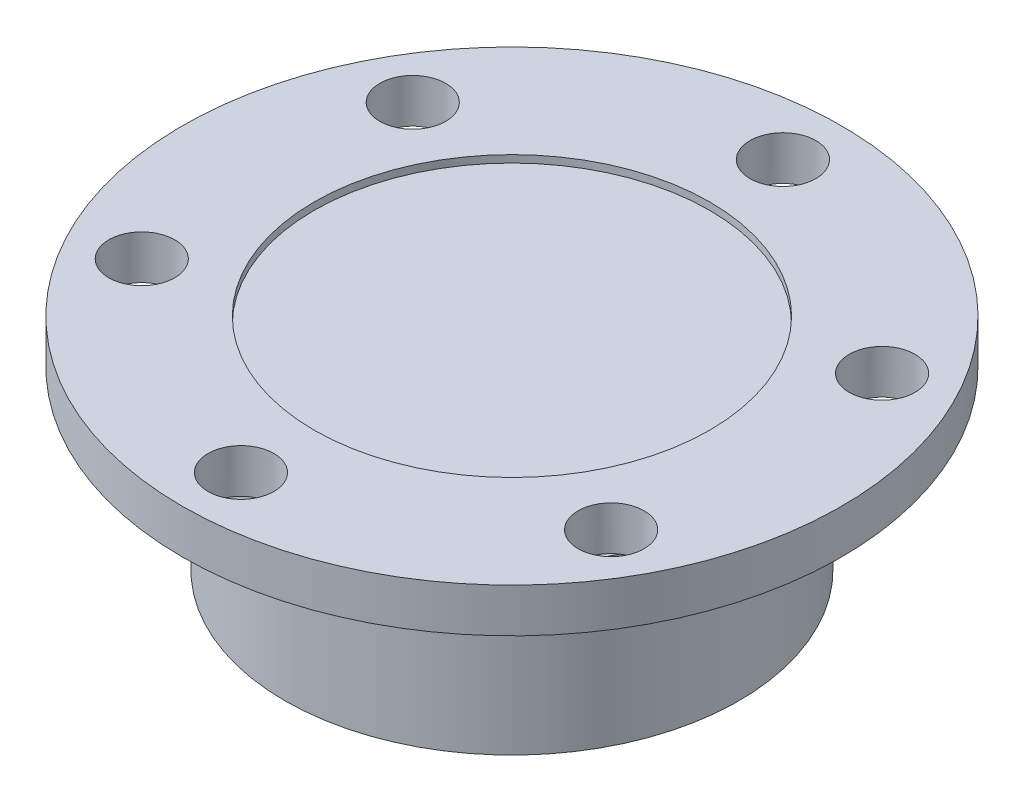
ISO-10303-21;
HEADER;
FILE_DESCRIPTION(('STEP AP214'),'2;1');
FILE_NAME('part.step','',(''),(''),'','','');
FILE_SCHEMA(('AUTOMOTIVE_DESIGN { 1 0 10303 214 1 1 1 1 }'));
ENDSEC;
DATA;
#1=APPLICATION_CONTEXT('core data for automotive mechanical design processes');
#2=APPLICATION_PROTOCOL_DEFINITION('international standard','automotive_design',2000,#1);
#3=PRODUCT_CONTEXT('',#1,'mechanical');
#4=PRODUCT('Part','Part','',(#3));
#5=PRODUCT_RELATED_PRODUCT_CATEGORY('part','',(#4));
#6=PRODUCT_DEFINITION_FORMATION('','',#4);
#7=PRODUCT_DEFINITION_CONTEXT('part definition',#1,'design');
#8=PRODUCT_DEFINITION('design','',#6,#7);
#9=PRODUCT_DEFINITION_SHAPE('','',#8);
#10=(LENGTH_UNIT() NAMED_UNIT(*) SI_UNIT(.MILLI.,.METRE.));
#11=(NAMED_UNIT(*) PLANE_ANGLE_UNIT() SI_UNIT($,.RADIAN.));
#12=(NAMED_UNIT(*) SI_UNIT($,.STERADIAN.) SOLID_ANGLE_UNIT());
#13=UNCERTAINTY_MEASURE_WITH_UNIT(LENGTH_MEASURE(1.E-05),#10,'distance_accuracy_value','');
#14=(GEOMETRIC_REPRESENTATION_CONTEXT(3) GLOBAL_UNCERTAINTY_ASSIGNED_CONTEXT((#13)) GLOBAL_UNIT_ASSIGNED_CONTEXT((#10,
#11,#12)) REPRESENTATION_CONTEXT('',''));
#15=CARTESIAN_POINT('',(0.,0.,0.));
#16=DIRECTION('',(0.,0.,1.));
#17=DIRECTION('',(1.,0.,0.));
#18=AXIS2_PLACEMENT_3D('',#15,#16,#17);
#19=CARTESIAN_POINT('',(-27.,29.,0.));
#20=DIRECTION('',(0.,1.,0.));
#21=DIRECTION('',(0.,0.,1.));
#22=AXIS2_PLACEMENT_3D('',#19,#20,#21);
#23=PLANE('',#22);
#24=CARTESIAN_POINT('',(0.,29.,0.));
#25=DIRECTION('',(0.,1.,0.));
#26=DIRECTION('',(0.,0.,1.));
#27=AXIS2_PLACEMENT_3D('',#24,#25,#26);
#28=CIRCLE('',#27,27.);
#29=CARTESIAN_POINT('',(0.,29.,27.));
#30=VERTEX_POINT('',#29);
#31=EDGE_CURVE('E64',#30,#30,#28,.T.);
#32=ORIENTED_EDGE('',*,*,#31,.T.);
#33=EDGE_LOOP('',(#32));
#34=FACE_BOUND('',#33,.T.);
#35=ADVANCED_FACE('F30',(#34),#23,.T.);
#36=CARTESIAN_POINT('',(-22.,26.5,0.));
#37=DIRECTION('',(0.,-1.,0.));
#38=DIRECTION('',(0.,0.,-1.));
#39=AXIS2_PLACEMENT_3D('',#36,#37,#38);
#40=PLANE('',#39);
#41=CARTESIAN_POINT('',(0.,26.5,0.));
#42=DIRECTION('',(0.,1.,0.));
#43=DIRECTION('',(0.,0.,1.));
#44=AXIS2_PLACEMENT_3D('',#41,#42,#43);
#45=CIRCLE('',#44,22.);
#46=CARTESIAN_POINT('',(0.,26.5,22.));
#47=VERTEX_POINT('',#46);
#48=EDGE_CURVE('E10',#47,#47,#45,.T.);
#49=ORIENTED_EDGE('',*,*,#48,.F.);
#50=EDGE_LOOP('',(#49));
#51=FACE_BOUND('',#50,.T.);
#52=ADVANCED_FACE('F133',(#51),#40,.T.);
#53=CARTESIAN_POINT('',(0.,0.,0.));
#54=DIRECTION('',(0.,-1.,0.));
#55=DIRECTION('',(0.,0.,-1.));
#56=AXIS2_PLACEMENT_3D('',#53,#54,#55);
#57=CONICAL_SURFACE('',#56,26.6726649887742,0.174532925199429);
#58=ORIENTED_EDGE('',*,*,#48,.T.);
#59=EDGE_LOOP('',(#58));
#60=FACE_BOUND('',#59,.T.);
#61=CARTESIAN_POINT('',(0.,0.,0.));
#62=DIRECTION('',(0.,1.,0.));
#63=DIRECTION('',(0.,0.,1.));
#64=AXIS2_PLACEMENT_3D('',#61,#62,#63);
#65=CIRCLE('',#64,26.6726649887742);
#66=CARTESIAN_POINT('',(0.,0.,26.6726649887742));
#67=VERTEX_POINT('',#66);
#68=EDGE_CURVE('E36',#67,#67,#65,.T.);
#69=ORIENTED_EDGE('',*,*,#68,.F.);
#70=EDGE_LOOP('',(#69));
#71=FACE_BOUND('',#70,.T.);
#72=ADVANCED_FACE('F137',(#60,#71),#57,.F.);
#73=CARTESIAN_POINT('',(-31.,0.,0.));
#74=DIRECTION('',(0.,-1.,0.));
#75=DIRECTION('',(0.,0.,-1.));
#76=AXIS2_PLACEMENT_3D('',#73,#74,#75);
#77=PLANE('',#76);
#78=ORIENTED_EDGE('',*,*,#68,.T.);
#79=EDGE_LOOP('',(#78));
#80=FACE_BOUND('',#79,.T.);
#81=CARTESIAN_POINT('',(0.,0.,0.));
#82=DIRECTION('',(0.,1.,0.));
#83=DIRECTION('',(0.,0.,1.));
#84=AXIS2_PLACEMENT_3D('',#81,#82,#83);
#85=CIRCLE('',#84,31.);
#86=CARTESIAN_POINT('',(0.,0.,31.));
#87=VERTEX_POINT('',#86);
#88=EDGE_CURVE('E40',#87,#87,#85,.T.);
#89=ORIENTED_EDGE('',*,*,#88,.F.);
#90=EDGE_LOOP('',(#89));
#91=FACE_BOUND('',#90,.T.);
#92=ADVANCED_FACE('F142',(#80,#91),#77,.T.);
#93=CARTESIAN_POINT('',(0.,30.6187975640425,0.));
#94=DIRECTION('',(0.,1.,0.));
#95=DIRECTION('',(0.,0.,1.));
#96=AXIS2_PLACEMENT_3D('',#93,#94,#95);
#97=CYLINDRICAL_SURFACE('',#96,31.);
#98=ORIENTED_EDGE('',*,*,#88,.T.);
#99=EDGE_LOOP('',(#98));
#100=FACE_BOUND('',#99,.T.);
#101=CARTESIAN_POINT('',(0.,22.5,0.));
#102=DIRECTION('',(0.,1.,0.));
#103=DIRECTION('',(0.,0.,1.));
#104=AXIS2_PLACEMENT_3D('',#101,#102,#103);
#105=CIRCLE('',#104,31.);
#106=CARTESIAN_POINT('',(0.,22.5,31.));
#107=VERTEX_POINT('',#106);
#108=EDGE_CURVE('E44',#107,#107,#105,.T.);
#109=ORIENTED_EDGE('',*,*,#108,.F.);
#110=EDGE_LOOP('',(#109));
#111=FACE_BOUND('',#110,.T.);
#112=ADVANCED_FACE('F147',(#100,#111),#97,.T.);
#113=CARTESIAN_POINT('',(-29.5,22.5,0.));
#114=DIRECTION('',(0.,1.,0.));
#115=DIRECTION('',(0.,0.,1.));
#116=AXIS2_PLACEMENT_3D('',#113,#114,#115);
#117=PLANE('',#116);
#118=ORIENTED_EDGE('',*,*,#108,.T.);
#119=EDGE_LOOP('',(#118));
#120=FACE_BOUND('',#119,.T.);
#121=CARTESIAN_POINT('',(0.,22.5,0.));
#122=DIRECTION('',(0.,1.,0.));
#123=DIRECTION('',(0.,0.,1.));
#124=AXIS2_PLACEMENT_3D('',#121,#122,#123);
#125=CIRCLE('',#124,29.5);
#126=CARTESIAN_POINT('',(0.,22.5,29.5));
#127=VERTEX_POINT('',#126);
#128=EDGE_CURVE('E49',#127,#127,#125,.T.);
#129=ORIENTED_EDGE('',*,*,#128,.F.);
#130=EDGE_LOOP('',(#129));
#131=FACE_BOUND('',#130,.T.);
#132=ADVANCED_FACE('F150',(#120,#131),#117,.T.);
#133=CARTESIAN_POINT('',(0.,30.6187975640425,0.));
#134=DIRECTION('',(0.,1.,0.));
#135=DIRECTION('',(0.,0.,1.));
#136=AXIS2_PLACEMENT_3D('',#133,#134,#135);
#137=CYLINDRICAL_SURFACE('',#136,29.5);
#138=ORIENTED_EDGE('',*,*,#128,.T.);
#139=EDGE_LOOP('',(#138));
#140=FACE_BOUND('',#139,.T.);
#141=CARTESIAN_POINT('',(0.,24.,0.));
#142=DIRECTION('',(0.,1.,0.));
#143=DIRECTION('',(0.,0.,1.));
#144=AXIS2_PLACEMENT_3D('',#141,#142,#143);
#145=CIRCLE('',#144,29.5);
#146=CARTESIAN_POINT('',(0.,24.,29.5));
#147=VERTEX_POINT('',#146);
#148=EDGE_CURVE('E52',#147,#147,#145,.T.);
#149=ORIENTED_EDGE('',*,*,#148,.F.);
#150=EDGE_LOOP('',(#149));
#151=FACE_BOUND('',#150,.T.);
#152=ADVANCED_FACE('F154',(#140,#151),#137,.T.);
#153=CARTESIAN_POINT('',(-45.,24.,0.));
#154=DIRECTION('',(0.,-1.,0.));
#155=DIRECTION('',(0.,0.,-1.));
#156=AXIS2_PLACEMENT_3D('',#153,#154,#155);
#157=PLANE('',#156);
#158=CARTESIAN_POINT('',(0.,24.,-37.));
#159=DIRECTION('',(0.,-1.,0.));
#160=DIRECTION('',(0.,0.,-1.));
#161=AXIS2_PLACEMENT_3D('',#158,#159,#160);
#162=CIRCLE('',#161,4.5);
#163=CARTESIAN_POINT('',(0.,24.,-41.5));
#164=VERTEX_POINT('',#163);
#165=EDGE_CURVE('E93',#164,#164,#162,.F.);
#166=ORIENTED_EDGE('',*,*,#165,.T.);
#167=EDGE_LOOP('',(#166));
#168=FACE_BOUND('',#167,.T.);
#169=CARTESIAN_POINT('',(-32.0429399400232,24.,-18.4999999999982));
#170=DIRECTION('',(0.,-1.,0.));
#171=DIRECTION('',(0.,0.,-1.));
#172=AXIS2_PLACEMENT_3D('',#169,#170,#171);
#173=CIRCLE('',#172,4.50000000000197);
#174=CARTESIAN_POINT('',(-32.0429399400232,24.,-23.0000000000001));
#175=VERTEX_POINT('',#174);
#176=EDGE_CURVE('E94',#175,#175,#173,.F.);
#177=ORIENTED_EDGE('',*,*,#176,.T.);
#178=EDGE_LOOP('',(#177));
#179=FACE_BOUND('',#178,.T.);
#180=CARTESIAN_POINT('',(-32.0429399400211,24.,18.5000000000018));
#181=DIRECTION('',(0.,-1.,0.));
#182=DIRECTION('',(0.,0.,-1.));
#183=AXIS2_PLACEMENT_3D('',#180,#181,#182);
#184=CIRCLE('',#183,4.5000000000039);
#185=CARTESIAN_POINT('',(-32.0429399400211,24.,13.9999999999979));
#186=VERTEX_POINT('',#185);
#187=EDGE_CURVE('E68',#186,#186,#184,.F.);
#188=ORIENTED_EDGE('',*,*,#187,.T.);
#189=EDGE_LOOP('',(#188));
#190=FACE_BOUND('',#189,.T.);
#191=CARTESIAN_POINT('',(4.1990728836402E-12,24.,37.));
#192=DIRECTION('',(0.,-1.,0.));
#193=DIRECTION('',(0.,0.,-1.));
#194=AXIS2_PLACEMENT_3D('',#191,#192,#193);
#195=CIRCLE('',#194,4.50000000000426);
#196=CARTESIAN_POINT('',(4.1990728836402E-12,24.,32.4999999999957));
#197=VERTEX_POINT('',#196);
#198=EDGE_CURVE('E75',#197,#197,#195,.F.);
#199=ORIENTED_EDGE('',*,*,#198,.T.);
#200=EDGE_LOOP('',(#199));
#201=FACE_BOUND('',#200,.T.);
#202=CARTESIAN_POINT('',(32.0429399400274,24.,18.4999999999982));
#203=DIRECTION('',(0.,-1.,0.));
#204=DIRECTION('',(0.,0.,-1.));
#205=AXIS2_PLACEMENT_3D('',#202,#203,#204);
#206=CIRCLE('',#205,4.50000000000265);
#207=CARTESIAN_POINT('',(32.0429399400274,24.,13.9999999999955));
#208=VERTEX_POINT('',#207);
#209=EDGE_CURVE('E81',#208,#208,#206,.F.);
#210=ORIENTED_EDGE('',*,*,#209,.T.);
#211=EDGE_LOOP('',(#210));
#212=FACE_BOUND('',#211,.T.);
#213=CARTESIAN_POINT('',(32.0429399400253,24.,-18.5000000000018));
#214=DIRECTION('',(0.,-1.,0.));
#215=DIRECTION('',(0.,0.,-1.));
#216=AXIS2_PLACEMENT_3D('',#213,#214,#215);
#217=CIRCLE('',#216,4.50000000000057);
#218=CARTESIAN_POINT('',(32.0429399400253,24.,-23.0000000000024));
#219=VERTEX_POINT('',#218);
#220=EDGE_CURVE('E87',#219,#219,#217,.F.);
#221=ORIENTED_EDGE('',*,*,#220,.T.);
#222=EDGE_LOOP('',(#221));
#223=FACE_BOUND('',#222,.T.);
#224=ORIENTED_EDGE('',*,*,#148,.T.);
#225=EDGE_LOOP('',(#224));
#226=FACE_BOUND('',#225,.T.);
#227=CARTESIAN_POINT('',(0.,24.,0.));
#228=DIRECTION('',(0.,1.,0.));
#229=DIRECTION('',(0.,0.,1.));
#230=AXIS2_PLACEMENT_3D('',#227,#228,#229);
#231=CIRCLE('',#230,45.);
#232=CARTESIAN_POINT('',(0.,24.,45.));
#233=VERTEX_POINT('',#232);
#234=EDGE_CURVE('E55',#233,#233,#231,.T.);
#235=ORIENTED_EDGE('',*,*,#234,.F.);
#236=EDGE_LOOP('',(#235));
#237=FACE_BOUND('',#236,.T.);
#238=ADVANCED_FACE('F158',(#168,#179,#190,#201,#212,#223,#226,#237),#157,.T.);
#239=CARTESIAN_POINT('',(0.,30.6187975640425,0.));
#240=DIRECTION('',(0.,1.,0.));
#241=DIRECTION('',(0.,0.,1.));
#242=AXIS2_PLACEMENT_3D('',#239,#240,#241);
#243=CYLINDRICAL_SURFACE('',#242,45.);
#244=ORIENTED_EDGE('',*,*,#234,.T.);
#245=EDGE_LOOP('',(#244));
#246=FACE_BOUND('',#245,.T.);
#247=CARTESIAN_POINT('',(0.,30.,0.));
#248=DIRECTION('',(0.,1.,0.));
#249=DIRECTION('',(0.,0.,1.));
#250=AXIS2_PLACEMENT_3D('',#247,#248,#249);
#251=CIRCLE('',#250,45.);
#252=CARTESIAN_POINT('',(0.,30.,45.));
#253=VERTEX_POINT('',#252);
#254=EDGE_CURVE('E58',#253,#253,#251,.T.);
#255=ORIENTED_EDGE('',*,*,#254,.F.);
#256=EDGE_LOOP('',(#255));
#257=FACE_BOUND('',#256,.T.);
#258=ADVANCED_FACE('F110',(#246,#257),#243,.T.);
#259=CARTESIAN_POINT('',(-45.,30.,0.));
#260=DIRECTION('',(0.,1.,0.));
#261=DIRECTION('',(0.,0.,1.));
#262=AXIS2_PLACEMENT_3D('',#259,#260,#261);
#263=PLANE('',#262);
#264=CARTESIAN_POINT('',(0.,30.,-37.));
#265=DIRECTION('',(0.,1.,0.));
#266=DIRECTION('',(0.,0.,1.));
#267=AXIS2_PLACEMENT_3D('',#264,#265,#266);
#268=CIRCLE('',#267,4.5);
#269=CARTESIAN_POINT('',(0.,30.,-32.5));
#270=VERTEX_POINT('',#269);
#271=EDGE_CURVE('E67',#270,#270,#268,.T.);
#272=ORIENTED_EDGE('',*,*,#271,.F.);
#273=EDGE_LOOP('',(#272));
#274=FACE_BOUND('',#273,.T.);
#275=CARTESIAN_POINT('',(-32.0429399400232,30.,-18.4999999999982));
#276=DIRECTION('',(0.,1.,0.));
#277=DIRECTION('',(0.,0.,1.));
#278=AXIS2_PLACEMENT_3D('',#275,#276,#277);
#279=CIRCLE('',#278,4.50000000000197);
#280=CARTESIAN_POINT('',(-32.0429399400232,30.,-13.9999999999962));
#281=VERTEX_POINT('',#280);
#282=EDGE_CURVE('E72',#281,#281,#279,.T.);
#283=ORIENTED_EDGE('',*,*,#282,.F.);
#284=EDGE_LOOP('',(#283));
#285=FACE_BOUND('',#284,.T.);
#286=CARTESIAN_POINT('',(-32.0429399400211,30.,18.5000000000018));
#287=DIRECTION('',(0.,1.,0.));
#288=DIRECTION('',(0.,0.,1.));
#289=AXIS2_PLACEMENT_3D('',#286,#287,#288);
#290=CIRCLE('',#289,4.5000000000039);
#291=CARTESIAN_POINT('',(-32.0429399400211,30.,23.0000000000057));
#292=VERTEX_POINT('',#291);
#293=EDGE_CURVE('E71',#292,#292,#290,.T.);
#294=ORIENTED_EDGE('',*,*,#293,.F.);
#295=EDGE_LOOP('',(#294));
#296=FACE_BOUND('',#295,.T.);
#297=CARTESIAN_POINT('',(4.1990728836402E-12,30.,37.));
#298=DIRECTION('',(0.,1.,0.));
#299=DIRECTION('',(0.,0.,1.));
#300=AXIS2_PLACEMENT_3D('',#297,#298,#299);
#301=CIRCLE('',#300,4.50000000000426);
#302=CARTESIAN_POINT('',(4.1990728836402E-12,30.,41.5000000000043));
#303=VERTEX_POINT('',#302);
#304=EDGE_CURVE('E78',#303,#303,#301,.T.);
#305=ORIENTED_EDGE('',*,*,#304,.F.);
#306=EDGE_LOOP('',(#305));
#307=FACE_BOUND('',#306,.T.);
#308=CARTESIAN_POINT('',(32.0429399400274,30.,18.4999999999982));
#309=DIRECTION('',(0.,1.,0.));
#310=DIRECTION('',(0.,0.,1.));
#311=AXIS2_PLACEMENT_3D('',#308,#309,#310);
#312=CIRCLE('',#311,4.50000000000265);
#313=CARTESIAN_POINT('',(32.0429399400274,30.,23.0000000000008));
#314=VERTEX_POINT('',#313);
#315=EDGE_CURVE('E84',#314,#314,#312,.T.);
#316=ORIENTED_EDGE('',*,*,#315,.F.);
#317=EDGE_LOOP('',(#316));
#318=FACE_BOUND('',#317,.T.);
#319=CARTESIAN_POINT('',(32.0429399400253,30.,-18.5000000000018));
#320=DIRECTION('',(0.,1.,0.));
#321=DIRECTION('',(0.,0.,1.));
#322=AXIS2_PLACEMENT_3D('',#319,#320,#321);
#323=CIRCLE('',#322,4.50000000000057);
#324=CARTESIAN_POINT('',(32.0429399400253,30.,-14.0000000000013));
#325=VERTEX_POINT('',#324);
#326=EDGE_CURVE('E90',#325,#325,#323,.T.);
#327=ORIENTED_EDGE('',*,*,#326,.F.);
#328=EDGE_LOOP('',(#327));
#329=FACE_BOUND('',#328,.T.);
#330=ORIENTED_EDGE('',*,*,#254,.T.);
#331=EDGE_LOOP('',(#330));
#332=FACE_BOUND('',#331,.T.);
#333=CARTESIAN_POINT('',(0.,30.,0.));
#334=DIRECTION('',(0.,1.,0.));
#335=DIRECTION('',(0.,0.,1.));
#336=AXIS2_PLACEMENT_3D('',#333,#334,#335);
#337=CIRCLE('',#336,27.);
#338=CARTESIAN_POINT('',(0.,30.,27.));
#339=VERTEX_POINT('',#338);
#340=EDGE_CURVE('E61',#339,#339,#337,.T.);
#341=ORIENTED_EDGE('',*,*,#340,.F.);
#342=EDGE_LOOP('',(#341));
#343=FACE_BOUND('',#342,.T.);
#344=ADVANCED_FACE('F106',(#274,#285,#296,#307,#318,#329,#332,#343),#263,.T.);
#345=CARTESIAN_POINT('',(0.,30.6187975640425,0.));
#346=DIRECTION('',(0.,1.,0.));
#347=DIRECTION('',(0.,0.,1.));
#348=AXIS2_PLACEMENT_3D('',#345,#346,#347);
#349=CYLINDRICAL_SURFACE('',#348,27.);
#350=ORIENTED_EDGE('',*,*,#340,.T.);
#351=EDGE_LOOP('',(#350));
#352=FACE_BOUND('',#351,.T.);
#353=ORIENTED_EDGE('',*,*,#31,.F.);
#354=EDGE_LOOP('',(#353));
#355=FACE_BOUND('',#354,.T.);
#356=ADVANCED_FACE('F109',(#352,#355),#349,.F.);
#357=CARTESIAN_POINT('',(32.0429399400253,-0.001000000000001,-18.5000000000018));
#358=DIRECTION('',(0.,1.,0.));
#359=DIRECTION('',(0.,0.,1.));
#360=AXIS2_PLACEMENT_3D('',#357,#358,#359);
#361=CYLINDRICAL_SURFACE('',#360,4.50000000000057);
#362=ORIENTED_EDGE('',*,*,#220,.F.);
#363=EDGE_LOOP('',(#362));
#364=FACE_BOUND('',#363,.T.);
#365=ORIENTED_EDGE('',*,*,#326,.T.);
#366=EDGE_LOOP('',(#365));
#367=FACE_BOUND('',#366,.T.);
#368=ADVANCED_FACE('F128',(#364,#367),#361,.F.);
#369=CARTESIAN_POINT('',(32.0429399400274,-0.001000000000001,18.4999999999982));
#370=DIRECTION('',(0.,1.,0.));
#371=DIRECTION('',(0.,0.,1.));
#372=AXIS2_PLACEMENT_3D('',#369,#370,#371);
#373=CYLINDRICAL_SURFACE('',#372,4.50000000000265);
#374=ORIENTED_EDGE('',*,*,#209,.F.);
#375=EDGE_LOOP('',(#374));
#376=FACE_BOUND('',#375,.T.);
#377=ORIENTED_EDGE('',*,*,#315,.T.);
#378=EDGE_LOOP('',(#377));
#379=FACE_BOUND('',#378,.T.);
#380=ADVANCED_FACE('F174',(#376,#379),#373,.F.);
#381=CARTESIAN_POINT('',(4.1990728836402E-12,-0.001000000000001,37.));
#382=DIRECTION('',(0.,1.,0.));
#383=DIRECTION('',(0.,0.,1.));
#384=AXIS2_PLACEMENT_3D('',#381,#382,#383);
#385=CYLINDRICAL_SURFACE('',#384,4.50000000000426);
#386=ORIENTED_EDGE('',*,*,#198,.F.);
#387=EDGE_LOOP('',(#386));
#388=FACE_BOUND('',#387,.T.);
#389=ORIENTED_EDGE('',*,*,#304,.T.);
#390=EDGE_LOOP('',(#389));
#391=FACE_BOUND('',#390,.T.);
#392=ADVANCED_FACE('F170',(#388,#391),#385,.F.);
#393=CARTESIAN_POINT('',(-32.0429399400211,-0.001000000000001,18.5000000000018));
#394=DIRECTION('',(0.,1.,0.));
#395=DIRECTION('',(0.,0.,1.));
#396=AXIS2_PLACEMENT_3D('',#393,#394,#395);
#397=CYLINDRICAL_SURFACE('',#396,4.5000000000039);
#398=ORIENTED_EDGE('',*,*,#187,.F.);
#399=EDGE_LOOP('',(#398));
#400=FACE_BOUND('',#399,.T.);
#401=ORIENTED_EDGE('',*,*,#293,.T.);
#402=EDGE_LOOP('',(#401));
#403=FACE_BOUND('',#402,.T.);
#404=ADVANCED_FACE('F166',(#400,#403),#397,.F.);
#405=CARTESIAN_POINT('',(-32.0429399400232,-0.001000000000001,-18.4999999999982));
#406=DIRECTION('',(0.,1.,0.));
#407=DIRECTION('',(0.,0.,1.));
#408=AXIS2_PLACEMENT_3D('',#405,#406,#407);
#409=CYLINDRICAL_SURFACE('',#408,4.50000000000197);
#410=ORIENTED_EDGE('',*,*,#176,.F.);
#411=EDGE_LOOP('',(#410));
#412=FACE_BOUND('',#411,.T.);
#413=ORIENTED_EDGE('',*,*,#282,.T.);
#414=EDGE_LOOP('',(#413));
#415=FACE_BOUND('',#414,.T.);
#416=ADVANCED_FACE('F169',(#412,#415),#409,.F.);
#417=CARTESIAN_POINT('',(0.,-0.001000000000001,-37.));
#418=DIRECTION('',(0.,1.,0.));
#419=DIRECTION('',(0.,0.,1.));
#420=AXIS2_PLACEMENT_3D('',#417,#418,#419);
#421=CYLINDRICAL_SURFACE('',#420,4.5);
#422=ORIENTED_EDGE('',*,*,#165,.F.);
#423=EDGE_LOOP('',(#422));
#424=FACE_BOUND('',#423,.T.);
#425=ORIENTED_EDGE('',*,*,#271,.T.);
#426=EDGE_LOOP('',(#425));
#427=FACE_BOUND('',#426,.T.);
#428=ADVANCED_FACE('F104',(#424,#427),#421,.F.);
#429=CLOSED_SHELL('',(#35,#52,#72,#92,#112,#132,#152,#238,#258,#344,#356,#368,#380,#392,#404,
#416,#428));
#430=MANIFOLD_SOLID_BREP('B2',#429);
#431=ADVANCED_BREP_SHAPE_REPRESENTATION('',(#18,#430),#14);
#432=SHAPE_DEFINITION_REPRESENTATION(#9,#431);
ENDSEC;
END-ISO-10303-21;
